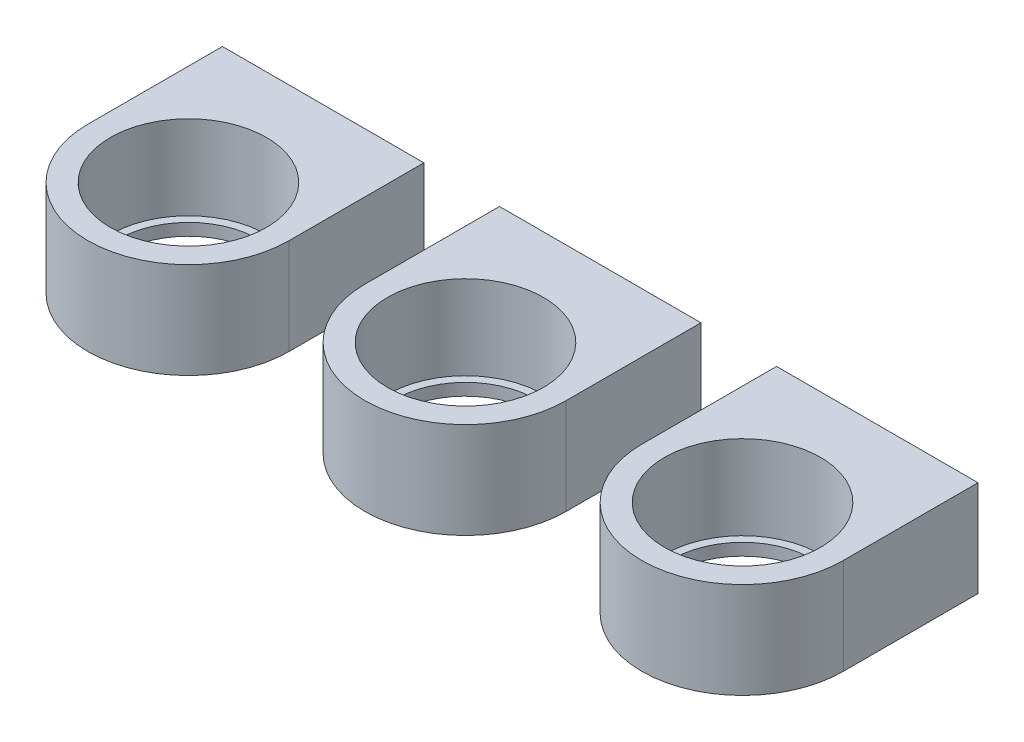
ISO-10303-21;
HEADER;
FILE_DESCRIPTION(('STEP AP214'),'2;1');
FILE_NAME('part.step','',(''),(''),'','','');
FILE_SCHEMA(('AUTOMOTIVE_DESIGN { 1 0 10303 214 1 1 1 1 }'));
ENDSEC;
DATA;
#1=APPLICATION_CONTEXT('core data for automotive mechanical design processes');
#2=APPLICATION_PROTOCOL_DEFINITION('international standard','automotive_design',2000,#1);
#3=PRODUCT_CONTEXT('',#1,'mechanical');
#4=PRODUCT('Part','Part','',(#3));
#5=PRODUCT_RELATED_PRODUCT_CATEGORY('part','',(#4));
#6=PRODUCT_DEFINITION_FORMATION('','',#4);
#7=PRODUCT_DEFINITION_CONTEXT('part definition',#1,'design');
#8=PRODUCT_DEFINITION('design','',#6,#7);
#9=PRODUCT_DEFINITION_SHAPE('','',#8);
#10=(LENGTH_UNIT() NAMED_UNIT(*) SI_UNIT(.MILLI.,.METRE.));
#11=(NAMED_UNIT(*) PLANE_ANGLE_UNIT() SI_UNIT($,.RADIAN.));
#12=(NAMED_UNIT(*) SI_UNIT($,.STERADIAN.) SOLID_ANGLE_UNIT());
#13=UNCERTAINTY_MEASURE_WITH_UNIT(LENGTH_MEASURE(1.E-05),#10,'distance_accuracy_value','');
#14=(GEOMETRIC_REPRESENTATION_CONTEXT(3) GLOBAL_UNCERTAINTY_ASSIGNED_CONTEXT((#13)) GLOBAL_UNIT_ASSIGNED_CONTEXT((#10,
#11,#12)) REPRESENTATION_CONTEXT('',''));
#15=CARTESIAN_POINT('',(0.,0.,0.));
#16=DIRECTION('',(0.,0.,1.));
#17=DIRECTION('',(1.,0.,0.));
#18=AXIS2_PLACEMENT_3D('',#15,#16,#17);
#19=CARTESIAN_POINT('',(-13.31875,12.7,-17.81875));
#20=DIRECTION('',(0.,0.,1.));
#21=DIRECTION('',(1.,0.,0.));
#22=AXIS2_PLACEMENT_3D('',#19,#20,#21);
#23=PLANE('',#22);
#24=DIRECTION('',(0.,-1.,0.));
#25=VECTOR('',#24,1.);
#26=CARTESIAN_POINT('',(13.31875,12.7,-17.81875));
#27=LINE('',#26,#25);
#28=CARTESIAN_POINT('',(13.31875,12.7,-17.81875));
#29=VERTEX_POINT('',#28);
#30=CARTESIAN_POINT('',(13.31875,0.,-17.81875));
#31=VERTEX_POINT('',#30);
#32=EDGE_CURVE('E99',#29,#31,#27,.T.);
#33=ORIENTED_EDGE('',*,*,#32,.T.);
#34=DIRECTION('',(1.,0.,0.));
#35=VECTOR('',#34,1.);
#36=CARTESIAN_POINT('',(-54.95625,0.,-17.81875));
#37=LINE('',#36,#35);
#38=CARTESIAN_POINT('',(-13.31875,0.,-17.81875));
#39=VERTEX_POINT('',#38);
#40=EDGE_CURVE('E12',#39,#31,#37,.T.);
#41=ORIENTED_EDGE('',*,*,#40,.F.);
#42=DIRECTION('',(0.,-1.,0.));
#43=VECTOR('',#42,1.);
#44=CARTESIAN_POINT('',(-13.31875,12.7,-17.81875));
#45=LINE('',#44,#43);
#46=CARTESIAN_POINT('',(-13.31875,12.7,-17.81875));
#47=VERTEX_POINT('',#46);
#48=EDGE_CURVE('E106',#47,#39,#45,.T.);
#49=ORIENTED_EDGE('',*,*,#48,.F.);
#50=DIRECTION('',(-1.,0.,0.));
#51=VECTOR('',#50,1.);
#52=CARTESIAN_POINT('',(-13.31875,12.7,-17.81875));
#53=LINE('',#52,#51);
#54=EDGE_CURVE('E89',#29,#47,#53,.T.);
#55=ORIENTED_EDGE('',*,*,#54,.F.);
#56=EDGE_LOOP('',(#33,#41,#49,#55));
#57=FACE_BOUND('',#56,.T.);
#58=ADVANCED_FACE('F47',(#57),#23,.F.);
#59=CARTESIAN_POINT('',(0.,12.7,0.));
#60=DIRECTION('',(0.,-1.,0.));
#61=DIRECTION('',(0.,0.,-1.));
#62=AXIS2_PLACEMENT_3D('',#59,#60,#61);
#63=CYLINDRICAL_SURFACE('',#62,9.25);
#64=CARTESIAN_POINT('',(0.,0.,0.));
#65=DIRECTION('',(0.,1.,0.));
#66=DIRECTION('',(0.,0.,1.));
#67=AXIS2_PLACEMENT_3D('',#64,#65,#66);
#68=CIRCLE('',#67,9.25);
#69=CARTESIAN_POINT('',(0.,0.,9.25));
#70=VERTEX_POINT('',#69);
#71=EDGE_CURVE('E55',#70,#70,#68,.T.);
#72=ORIENTED_EDGE('',*,*,#71,.F.);
#73=EDGE_LOOP('',(#72));
#74=FACE_BOUND('',#73,.T.);
#75=CARTESIAN_POINT('',(0.,1.5875,0.));
#76=DIRECTION('',(0.,1.,0.));
#77=DIRECTION('',(0.,0.,1.));
#78=AXIS2_PLACEMENT_3D('',#75,#76,#77);
#79=CIRCLE('',#78,9.25);
#80=CARTESIAN_POINT('',(0.,1.5875,9.25));
#81=VERTEX_POINT('',#80);
#82=EDGE_CURVE('E103',#81,#81,#79,.T.);
#83=ORIENTED_EDGE('',*,*,#82,.T.);
#84=EDGE_LOOP('',(#83));
#85=FACE_BOUND('',#84,.T.);
#86=ADVANCED_FACE('F133',(#74,#85),#63,.F.);
#87=CARTESIAN_POINT('',(0.,12.7,0.));
#88=DIRECTION('',(0.,1.,0.));
#89=DIRECTION('',(0.,0.,1.));
#90=AXIS2_PLACEMENT_3D('',#87,#88,#89);
#91=PLANE('',#90);
#92=CARTESIAN_POINT('',(0.,12.7,0.));
#93=DIRECTION('',(0.,1.,0.));
#94=DIRECTION('',(0.,0.,1.));
#95=AXIS2_PLACEMENT_3D('',#92,#93,#94);
#96=CIRCLE('',#95,10.31875);
#97=CARTESIAN_POINT('',(0.,12.7,10.31875));
#98=VERTEX_POINT('',#97);
#99=EDGE_CURVE('E117',#98,#98,#96,.T.);
#100=ORIENTED_EDGE('',*,*,#99,.F.);
#101=EDGE_LOOP('',(#100));
#102=FACE_BOUND('',#101,.T.);
#103=ORIENTED_EDGE('',*,*,#54,.T.);
#104=DIRECTION('',(0.,0.,1.));
#105=VECTOR('',#104,1.);
#106=CARTESIAN_POINT('',(-13.31875,12.7,-13.31875));
#107=LINE('',#106,#105);
#108=CARTESIAN_POINT('',(-13.31875,12.7,0.));
#109=VERTEX_POINT('',#108);
#110=EDGE_CURVE('E107',#47,#109,#107,.T.);
#111=ORIENTED_EDGE('',*,*,#110,.T.);
#112=CARTESIAN_POINT('',(0.,12.7,0.));
#113=DIRECTION('',(0.,1.,0.));
#114=DIRECTION('',(0.,0.,1.));
#115=AXIS2_PLACEMENT_3D('',#112,#113,#114);
#116=CIRCLE('',#115,13.31875);
#117=CARTESIAN_POINT('',(13.31875,12.7,0.));
#118=VERTEX_POINT('',#117);
#119=EDGE_CURVE('E92',#109,#118,#116,.T.);
#120=ORIENTED_EDGE('',*,*,#119,.T.);
#121=DIRECTION('',(0.,0.,-1.));
#122=VECTOR('',#121,1.);
#123=CARTESIAN_POINT('',(13.31875,12.7,-13.31875));
#124=LINE('',#123,#122);
#125=EDGE_CURVE('E85',#118,#29,#124,.T.);
#126=ORIENTED_EDGE('',*,*,#125,.T.);
#127=EDGE_LOOP('',(#103,#111,#120,#126));
#128=FACE_BOUND('',#127,.T.);
#129=ADVANCED_FACE('F87',(#102,#128),#91,.T.);
#130=CARTESIAN_POINT('',(-13.31875,12.7,0.));
#131=DIRECTION('',(1.,0.,0.));
#132=DIRECTION('',(0.,0.,-1.));
#133=AXIS2_PLACEMENT_3D('',#130,#131,#132);
#134=PLANE('',#133);
#135=DIRECTION('',(0.,0.,1.));
#136=VECTOR('',#135,1.);
#137=CARTESIAN_POINT('',(-13.31875,0.,0.));
#138=LINE('',#137,#136);
#139=CARTESIAN_POINT('',(-13.31875,0.,0.));
#140=VERTEX_POINT('',#139);
#141=EDGE_CURVE('E61',#39,#140,#138,.T.);
#142=ORIENTED_EDGE('',*,*,#141,.T.);
#143=DIRECTION('',(0.,-1.,0.));
#144=VECTOR('',#143,1.);
#145=CARTESIAN_POINT('',(-13.31875,12.7,0.));
#146=LINE('',#145,#144);
#147=EDGE_CURVE('E163',#109,#140,#146,.T.);
#148=ORIENTED_EDGE('',*,*,#147,.F.);
#149=ORIENTED_EDGE('',*,*,#110,.F.);
#150=ORIENTED_EDGE('',*,*,#48,.T.);
#151=EDGE_LOOP('',(#142,#148,#149,#150));
#152=FACE_BOUND('',#151,.T.);
#153=ADVANCED_FACE('F132',(#152),#134,.F.);
#154=CARTESIAN_POINT('',(0.,12.7,0.));
#155=DIRECTION('',(0.,-1.,0.));
#156=DIRECTION('',(0.,0.,-1.));
#157=AXIS2_PLACEMENT_3D('',#154,#155,#156);
#158=CYLINDRICAL_SURFACE('',#157,13.31875);
#159=CARTESIAN_POINT('',(0.,0.,0.));
#160=DIRECTION('',(0.,1.,0.));
#161=DIRECTION('',(0.,0.,1.));
#162=AXIS2_PLACEMENT_3D('',#159,#160,#161);
#163=CIRCLE('',#162,13.31875);
#164=CARTESIAN_POINT('',(13.31875,0.,0.));
#165=VERTEX_POINT('',#164);
#166=EDGE_CURVE('E67',#140,#165,#163,.T.);
#167=ORIENTED_EDGE('',*,*,#166,.T.);
#168=DIRECTION('',(0.,-1.,0.));
#169=VECTOR('',#168,1.);
#170=CARTESIAN_POINT('',(13.31875,12.7,0.));
#171=LINE('',#170,#169);
#172=EDGE_CURVE('E119',#118,#165,#171,.T.);
#173=ORIENTED_EDGE('',*,*,#172,.F.);
#174=ORIENTED_EDGE('',*,*,#119,.F.);
#175=ORIENTED_EDGE('',*,*,#147,.T.);
#176=EDGE_LOOP('',(#167,#173,#174,#175));
#177=FACE_BOUND('',#176,.T.);
#178=ADVANCED_FACE('F139',(#177),#158,.T.);
#179=CARTESIAN_POINT('',(13.31875,12.7,-17.81875));
#180=DIRECTION('',(-1.,0.,0.));
#181=DIRECTION('',(0.,0.,1.));
#182=AXIS2_PLACEMENT_3D('',#179,#180,#181);
#183=PLANE('',#182);
#184=DIRECTION('',(0.,0.,-1.));
#185=VECTOR('',#184,1.);
#186=CARTESIAN_POINT('',(13.31875,0.,-17.81875));
#187=LINE('',#186,#185);
#188=EDGE_CURVE('E101',#165,#31,#187,.T.);
#189=ORIENTED_EDGE('',*,*,#188,.T.);
#190=ORIENTED_EDGE('',*,*,#32,.F.);
#191=ORIENTED_EDGE('',*,*,#125,.F.);
#192=ORIENTED_EDGE('',*,*,#172,.T.);
#193=EDGE_LOOP('',(#189,#190,#191,#192));
#194=FACE_BOUND('',#193,.T.);
#195=ADVANCED_FACE('F100',(#194),#183,.F.);
#196=CARTESIAN_POINT('',(0.,1.5875,0.));
#197=DIRECTION('',(0.,1.,0.));
#198=DIRECTION('',(0.,0.,1.));
#199=AXIS2_PLACEMENT_3D('',#196,#197,#198);
#200=CYLINDRICAL_SURFACE('',#199,10.31875);
#201=CARTESIAN_POINT('',(0.,1.5875,0.));
#202=DIRECTION('',(0.,1.,0.));
#203=DIRECTION('',(0.,0.,1.));
#204=AXIS2_PLACEMENT_3D('',#201,#202,#203);
#205=CIRCLE('',#204,10.31875);
#206=CARTESIAN_POINT('',(0.,1.5875,10.31875));
#207=VERTEX_POINT('',#206);
#208=EDGE_CURVE('E116',#207,#207,#205,.T.);
#209=ORIENTED_EDGE('',*,*,#208,.F.);
#210=EDGE_LOOP('',(#209));
#211=FACE_BOUND('',#210,.T.);
#212=ORIENTED_EDGE('',*,*,#99,.T.);
#213=EDGE_LOOP('',(#212));
#214=FACE_BOUND('',#213,.T.);
#215=ADVANCED_FACE('F125',(#211,#214),#200,.F.);
#216=CARTESIAN_POINT('',(0.,1.5875,0.));
#217=DIRECTION('',(0.,1.,0.));
#218=DIRECTION('',(0.,0.,1.));
#219=AXIS2_PLACEMENT_3D('',#216,#217,#218);
#220=PLANE('',#219);
#221=ORIENTED_EDGE('',*,*,#82,.F.);
#222=EDGE_LOOP('',(#221));
#223=FACE_BOUND('',#222,.T.);
#224=ORIENTED_EDGE('',*,*,#208,.T.);
#225=EDGE_LOOP('',(#224));
#226=FACE_BOUND('',#225,.T.);
#227=ADVANCED_FACE('F123',(#223,#226),#220,.T.);
#228=CARTESIAN_POINT('',(-54.95625,0.,27.18125));
#229=DIRECTION('',(0.,1.,0.));
#230=DIRECTION('',(0.,0.,1.));
#231=AXIS2_PLACEMENT_3D('',#228,#229,#230);
#232=PLANE('',#231);
#233=ORIENTED_EDGE('',*,*,#71,.T.);
#234=EDGE_LOOP('',(#233));
#235=FACE_BOUND('',#234,.T.);
#236=ORIENTED_EDGE('',*,*,#40,.T.);
#237=ORIENTED_EDGE('',*,*,#188,.F.);
#238=ORIENTED_EDGE('',*,*,#166,.F.);
#239=ORIENTED_EDGE('',*,*,#141,.F.);
#240=EDGE_LOOP('',(#236,#237,#238,#239));
#241=FACE_BOUND('',#240,.T.);
#242=ADVANCED_FACE('F49',(#235,#241),#232,.F.);
#243=CLOSED_SHELL('',(#58,#86,#129,#153,#178,#195,#215,#227,#242));
#244=MANIFOLD_SOLID_BREP('B2',#243);
#245=CARTESIAN_POINT('',(36.6375,1.5875,0.));
#246=DIRECTION('',(0.,1.,0.));
#247=DIRECTION('',(0.,0.,1.));
#248=AXIS2_PLACEMENT_3D('',#245,#246,#247);
#249=PLANE('',#248);
#250=CARTESIAN_POINT('',(36.6375,1.5875,0.));
#251=DIRECTION('',(0.,-1.,0.));
#252=DIRECTION('',(0.,0.,1.));
#253=AXIS2_PLACEMENT_3D('',#250,#251,#252);
#254=CIRCLE('',#253,9.25);
#255=CARTESIAN_POINT('',(36.6375,1.5875,9.25));
#256=VERTEX_POINT('',#255);
#257=EDGE_CURVE('E333',#256,#256,#254,.T.);
#258=ORIENTED_EDGE('',*,*,#257,.T.);
#259=EDGE_LOOP('',(#258));
#260=FACE_BOUND('',#259,.T.);
#261=CARTESIAN_POINT('',(36.6375,1.5875,0.));
#262=DIRECTION('',(0.,-1.,0.));
#263=DIRECTION('',(0.,0.,1.));
#264=AXIS2_PLACEMENT_3D('',#261,#262,#263);
#265=CIRCLE('',#264,10.31875);
#266=CARTESIAN_POINT('',(36.6375,1.5875,10.31875));
#267=VERTEX_POINT('',#266);
#268=EDGE_CURVE('E332',#267,#267,#265,.T.);
#269=ORIENTED_EDGE('',*,*,#268,.F.);
#270=EDGE_LOOP('',(#269));
#271=FACE_BOUND('',#270,.T.);
#272=ADVANCED_FACE('F257',(#260,#271),#249,.T.);
#273=CARTESIAN_POINT('',(36.6375,12.7,0.));
#274=DIRECTION('',(0.,-1.,0.));
#275=DIRECTION('',(0.,0.,-1.));
#276=AXIS2_PLACEMENT_3D('',#273,#274,#275);
#277=CYLINDRICAL_SURFACE('',#276,9.25);
#278=CARTESIAN_POINT('',(36.6375,0.,0.));
#279=DIRECTION('',(0.,-1.,0.));
#280=DIRECTION('',(0.,0.,1.));
#281=AXIS2_PLACEMENT_3D('',#278,#279,#280);
#282=CIRCLE('',#281,9.25);
#283=CARTESIAN_POINT('',(36.6375,0.,9.25));
#284=VERTEX_POINT('',#283);
#285=EDGE_CURVE('E329',#284,#284,#282,.T.);
#286=ORIENTED_EDGE('',*,*,#285,.T.);
#287=EDGE_LOOP('',(#286));
#288=FACE_BOUND('',#287,.T.);
#289=ORIENTED_EDGE('',*,*,#257,.F.);
#290=EDGE_LOOP('',(#289));
#291=FACE_BOUND('',#290,.T.);
#292=ADVANCED_FACE('F346',(#288,#291),#277,.F.);
#293=CARTESIAN_POINT('',(36.6375,1.5875,0.));
#294=DIRECTION('',(0.,1.,0.));
#295=DIRECTION('',(0.,0.,1.));
#296=AXIS2_PLACEMENT_3D('',#293,#294,#295);
#297=CYLINDRICAL_SURFACE('',#296,10.31875);
#298=ORIENTED_EDGE('',*,*,#268,.T.);
#299=EDGE_LOOP('',(#298));
#300=FACE_BOUND('',#299,.T.);
#301=CARTESIAN_POINT('',(36.6375,12.7,0.));
#302=DIRECTION('',(0.,-1.,0.));
#303=DIRECTION('',(0.,0.,1.));
#304=AXIS2_PLACEMENT_3D('',#301,#302,#303);
#305=CIRCLE('',#304,10.31875);
#306=CARTESIAN_POINT('',(36.6375,12.7,10.31875));
#307=VERTEX_POINT('',#306);
#308=EDGE_CURVE('E334',#307,#307,#305,.T.);
#309=ORIENTED_EDGE('',*,*,#308,.F.);
#310=EDGE_LOOP('',(#309));
#311=FACE_BOUND('',#310,.T.);
#312=ADVANCED_FACE('F349',(#300,#311),#297,.F.);
#313=CARTESIAN_POINT('',(36.6375,12.7,0.));
#314=DIRECTION('',(0.,1.,0.));
#315=DIRECTION('',(0.,0.,1.));
#316=AXIS2_PLACEMENT_3D('',#313,#314,#315);
#317=PLANE('',#316);
#318=ORIENTED_EDGE('',*,*,#308,.T.);
#319=EDGE_LOOP('',(#318));
#320=FACE_BOUND('',#319,.T.);
#321=DIRECTION('',(1.,0.,0.));
#322=VECTOR('',#321,1.);
#323=CARTESIAN_POINT('',(49.95625,12.7,-17.81875));
#324=LINE('',#323,#322);
#325=CARTESIAN_POINT('',(23.31875,12.7,-17.81875));
#326=VERTEX_POINT('',#325);
#327=CARTESIAN_POINT('',(49.95625,12.7,-17.81875));
#328=VERTEX_POINT('',#327);
#329=EDGE_CURVE('E327',#326,#328,#324,.T.);
#330=ORIENTED_EDGE('',*,*,#329,.F.);
#331=DIRECTION('',(0.,0.,-1.));
#332=VECTOR('',#331,1.);
#333=CARTESIAN_POINT('',(23.31875,12.7,-13.31875));
#334=LINE('',#333,#332);
#335=CARTESIAN_POINT('',(23.31875,12.7,0.));
#336=VERTEX_POINT('',#335);
#337=EDGE_CURVE('E321',#336,#326,#334,.T.);
#338=ORIENTED_EDGE('',*,*,#337,.F.);
#339=CARTESIAN_POINT('',(36.6375,12.7,0.));
#340=DIRECTION('',(0.,-1.,0.));
#341=DIRECTION('',(0.,0.,1.));
#342=AXIS2_PLACEMENT_3D('',#339,#340,#341);
#343=CIRCLE('',#342,13.31875);
#344=CARTESIAN_POINT('',(49.95625,12.7,0.));
#345=VERTEX_POINT('',#344);
#346=EDGE_CURVE('E305',#345,#336,#343,.T.);
#347=ORIENTED_EDGE('',*,*,#346,.F.);
#348=DIRECTION('',(0.,0.,1.));
#349=VECTOR('',#348,1.);
#350=CARTESIAN_POINT('',(49.95625,12.7,-13.31875));
#351=LINE('',#350,#349);
#352=EDGE_CURVE('E313',#328,#345,#351,.T.);
#353=ORIENTED_EDGE('',*,*,#352,.F.);
#354=EDGE_LOOP('',(#330,#338,#347,#353));
#355=FACE_BOUND('',#354,.T.);
#356=ADVANCED_FACE('F320',(#320,#355),#317,.T.);
#357=CARTESIAN_POINT('',(23.31875,12.7,-17.81875));
#358=DIRECTION('',(1.,0.,0.));
#359=DIRECTION('',(0.,0.,1.));
#360=AXIS2_PLACEMENT_3D('',#357,#358,#359);
#361=PLANE('',#360);
#362=DIRECTION('',(0.,0.,-1.));
#363=VECTOR('',#362,1.);
#364=CARTESIAN_POINT('',(23.31875,0.,-17.81875));
#365=LINE('',#364,#363);
#366=CARTESIAN_POINT('',(23.31875,0.,0.));
#367=VERTEX_POINT('',#366);
#368=CARTESIAN_POINT('',(23.31875,0.,-17.81875));
#369=VERTEX_POINT('',#368);
#370=EDGE_CURVE('E282',#367,#369,#365,.T.);
#371=ORIENTED_EDGE('',*,*,#370,.F.);
#372=DIRECTION('',(0.,-1.,0.));
#373=VECTOR('',#372,1.);
#374=CARTESIAN_POINT('',(23.31875,12.7,0.));
#375=LINE('',#374,#373);
#376=EDGE_CURVE('E310',#336,#367,#375,.T.);
#377=ORIENTED_EDGE('',*,*,#376,.F.);
#378=ORIENTED_EDGE('',*,*,#337,.T.);
#379=DIRECTION('',(0.,-1.,0.));
#380=VECTOR('',#379,1.);
#381=CARTESIAN_POINT('',(23.31875,12.7,-17.81875));
#382=LINE('',#381,#380);
#383=EDGE_CURVE('E289',#326,#369,#382,.T.);
#384=ORIENTED_EDGE('',*,*,#383,.T.);
#385=EDGE_LOOP('',(#371,#377,#378,#384));
#386=FACE_BOUND('',#385,.T.);
#387=ADVANCED_FACE('F365',(#386),#361,.F.);
#388=CARTESIAN_POINT('',(36.6375,12.7,0.));
#389=DIRECTION('',(0.,-1.,0.));
#390=DIRECTION('',(0.,0.,-1.));
#391=AXIS2_PLACEMENT_3D('',#388,#389,#390);
#392=CYLINDRICAL_SURFACE('',#391,13.31875);
#393=CARTESIAN_POINT('',(36.6375,0.,0.));
#394=DIRECTION('',(0.,-1.,0.));
#395=DIRECTION('',(0.,0.,1.));
#396=AXIS2_PLACEMENT_3D('',#393,#394,#395);
#397=CIRCLE('',#396,13.31875);
#398=CARTESIAN_POINT('',(49.95625,0.,0.));
#399=VERTEX_POINT('',#398);
#400=EDGE_CURVE('E45',#399,#367,#397,.T.);
#401=ORIENTED_EDGE('',*,*,#400,.F.);
#402=DIRECTION('',(0.,-1.,0.));
#403=VECTOR('',#402,1.);
#404=CARTESIAN_POINT('',(49.95625,12.7,0.));
#405=LINE('',#404,#403);
#406=EDGE_CURVE('E300',#345,#399,#405,.T.);
#407=ORIENTED_EDGE('',*,*,#406,.F.);
#408=ORIENTED_EDGE('',*,*,#346,.T.);
#409=ORIENTED_EDGE('',*,*,#376,.T.);
#410=EDGE_LOOP('',(#401,#407,#408,#409));
#411=FACE_BOUND('',#410,.T.);
#412=ADVANCED_FACE('F302',(#411),#392,.T.);
#413=CARTESIAN_POINT('',(49.95625,12.7,0.));
#414=DIRECTION('',(-1.,0.,0.));
#415=DIRECTION('',(0.,0.,-1.));
#416=AXIS2_PLACEMENT_3D('',#413,#414,#415);
#417=PLANE('',#416);
#418=ORIENTED_EDGE('',*,*,#406,.T.);
#419=DIRECTION('',(0.,0.,-1.));
#420=VECTOR('',#419,1.);
#421=CARTESIAN_POINT('',(49.95625,0.,27.18125));
#422=LINE('',#421,#420);
#423=CARTESIAN_POINT('',(49.95625,0.,-17.81875));
#424=VERTEX_POINT('',#423);
#425=EDGE_CURVE('E309',#399,#424,#422,.T.);
#426=ORIENTED_EDGE('',*,*,#425,.T.);
#427=DIRECTION('',(0.,-1.,0.));
#428=VECTOR('',#427,1.);
#429=CARTESIAN_POINT('',(49.95625,12.7,-17.81875));
#430=LINE('',#429,#428);
#431=EDGE_CURVE('E316',#328,#424,#430,.T.);
#432=ORIENTED_EDGE('',*,*,#431,.F.);
#433=ORIENTED_EDGE('',*,*,#352,.T.);
#434=EDGE_LOOP('',(#418,#426,#432,#433));
#435=FACE_BOUND('',#434,.T.);
#436=ADVANCED_FACE('F314',(#435),#417,.F.);
#437=CARTESIAN_POINT('',(-13.31875,12.7,-17.81875));
#438=DIRECTION('',(0.,0.,1.));
#439=DIRECTION('',(1.,0.,0.));
#440=AXIS2_PLACEMENT_3D('',#437,#438,#439);
#441=PLANE('',#440);
#442=ORIENTED_EDGE('',*,*,#431,.T.);
#443=DIRECTION('',(1.,0.,0.));
#444=VECTOR('',#443,1.);
#445=CARTESIAN_POINT('',(-54.95625,0.,-17.81875));
#446=LINE('',#445,#444);
#447=EDGE_CURVE('E261',#369,#424,#446,.T.);
#448=ORIENTED_EDGE('',*,*,#447,.F.);
#449=ORIENTED_EDGE('',*,*,#383,.F.);
#450=ORIENTED_EDGE('',*,*,#329,.T.);
#451=EDGE_LOOP('',(#442,#448,#449,#450));
#452=FACE_BOUND('',#451,.T.);
#453=ADVANCED_FACE('F338',(#452),#441,.F.);
#454=CARTESIAN_POINT('',(-54.95625,0.,27.18125));
#455=DIRECTION('',(0.,1.,0.));
#456=DIRECTION('',(0.,0.,1.));
#457=AXIS2_PLACEMENT_3D('',#454,#455,#456);
#458=PLANE('',#457);
#459=ORIENTED_EDGE('',*,*,#370,.T.);
#460=ORIENTED_EDGE('',*,*,#447,.T.);
#461=ORIENTED_EDGE('',*,*,#425,.F.);
#462=ORIENTED_EDGE('',*,*,#400,.T.);
#463=EDGE_LOOP('',(#459,#460,#461,#462));
#464=FACE_BOUND('',#463,.T.);
#465=ORIENTED_EDGE('',*,*,#285,.F.);
#466=EDGE_LOOP('',(#465));
#467=FACE_BOUND('',#466,.T.);
#468=ADVANCED_FACE('F259',(#464,#467),#458,.F.);
#469=CLOSED_SHELL('',(#272,#292,#312,#356,#387,#412,#436,#453,#468));
#470=MANIFOLD_SOLID_BREP('B6',#469);
#471=CARTESIAN_POINT('',(-36.6375,1.5875,0.));
#472=DIRECTION('',(0.,1.,0.));
#473=DIRECTION('',(0.,0.,1.));
#474=AXIS2_PLACEMENT_3D('',#471,#472,#473);
#475=PLANE('',#474);
#476=CARTESIAN_POINT('',(-36.6375,1.5875,0.));
#477=DIRECTION('',(0.,-1.,0.));
#478=DIRECTION('',(0.,0.,1.));
#479=AXIS2_PLACEMENT_3D('',#476,#477,#478);
#480=CIRCLE('',#479,9.25);
#481=CARTESIAN_POINT('',(-36.6375,1.5875,9.25));
#482=VERTEX_POINT('',#481);
#483=EDGE_CURVE('E465',#482,#482,#480,.T.);
#484=ORIENTED_EDGE('',*,*,#483,.T.);
#485=EDGE_LOOP('',(#484));
#486=FACE_BOUND('',#485,.T.);
#487=CARTESIAN_POINT('',(-36.6375,1.5875,0.));
#488=DIRECTION('',(0.,-1.,0.));
#489=DIRECTION('',(0.,0.,1.));
#490=AXIS2_PLACEMENT_3D('',#487,#488,#489);
#491=CIRCLE('',#490,10.31875);
#492=CARTESIAN_POINT('',(-36.6375,1.5875,10.31875));
#493=VERTEX_POINT('',#492);
#494=EDGE_CURVE('E545',#493,#493,#491,.T.);
#495=ORIENTED_EDGE('',*,*,#494,.F.);
#496=EDGE_LOOP('',(#495));
#497=FACE_BOUND('',#496,.T.);
#498=ADVANCED_FACE('F461',(#486,#497),#475,.T.);
#499=CARTESIAN_POINT('',(-36.6375,12.7,0.));
#500=DIRECTION('',(0.,-1.,0.));
#501=DIRECTION('',(0.,0.,-1.));
#502=AXIS2_PLACEMENT_3D('',#499,#500,#501);
#503=CYLINDRICAL_SURFACE('',#502,9.25);
#504=CARTESIAN_POINT('',(-36.6375,0.,0.));
#505=DIRECTION('',(0.,-1.,0.));
#506=DIRECTION('',(0.,0.,1.));
#507=AXIS2_PLACEMENT_3D('',#504,#505,#506);
#508=CIRCLE('',#507,9.25);
#509=CARTESIAN_POINT('',(-36.6375,0.,9.25));
#510=VERTEX_POINT('',#509);
#511=EDGE_CURVE('E513',#510,#510,#508,.T.);
#512=ORIENTED_EDGE('',*,*,#511,.T.);
#513=EDGE_LOOP('',(#512));
#514=FACE_BOUND('',#513,.T.);
#515=ORIENTED_EDGE('',*,*,#483,.F.);
#516=EDGE_LOOP('',(#515));
#517=FACE_BOUND('',#516,.T.);
#518=ADVANCED_FACE('F554',(#514,#517),#503,.F.);
#519=CARTESIAN_POINT('',(-36.6375,1.5875,0.));
#520=DIRECTION('',(0.,1.,0.));
#521=DIRECTION('',(0.,0.,1.));
#522=AXIS2_PLACEMENT_3D('',#519,#520,#521);
#523=CYLINDRICAL_SURFACE('',#522,10.31875);
#524=ORIENTED_EDGE('',*,*,#494,.T.);
#525=EDGE_LOOP('',(#524));
#526=FACE_BOUND('',#525,.T.);
#527=CARTESIAN_POINT('',(-36.6375,12.7,0.));
#528=DIRECTION('',(0.,-1.,0.));
#529=DIRECTION('',(0.,0.,1.));
#530=AXIS2_PLACEMENT_3D('',#527,#528,#529);
#531=CIRCLE('',#530,10.31875);
#532=CARTESIAN_POINT('',(-36.6375,12.7,10.31875));
#533=VERTEX_POINT('',#532);
#534=EDGE_CURVE('E542',#533,#533,#531,.T.);
#535=ORIENTED_EDGE('',*,*,#534,.F.);
#536=EDGE_LOOP('',(#535));
#537=FACE_BOUND('',#536,.T.);
#538=ADVANCED_FACE('F556',(#526,#537),#523,.F.);
#539=CARTESIAN_POINT('',(-36.6375,12.7,0.));
#540=DIRECTION('',(0.,1.,0.));
#541=DIRECTION('',(0.,0.,1.));
#542=AXIS2_PLACEMENT_3D('',#539,#540,#541);
#543=PLANE('',#542);
#544=ORIENTED_EDGE('',*,*,#534,.T.);
#545=EDGE_LOOP('',(#544));
#546=FACE_BOUND('',#545,.T.);
#547=DIRECTION('',(1.,0.,0.));
#548=VECTOR('',#547,1.);
#549=CARTESIAN_POINT('',(-23.31875,12.7,-17.81875));
#550=LINE('',#549,#548);
#551=CARTESIAN_POINT('',(-49.95625,12.7,-17.81875));
#552=VERTEX_POINT('',#551);
#553=CARTESIAN_POINT('',(-23.31875,12.7,-17.81875));
#554=VERTEX_POINT('',#553);
#555=EDGE_CURVE('E511',#552,#554,#550,.T.);
#556=ORIENTED_EDGE('',*,*,#555,.F.);
#557=DIRECTION('',(0.,0.,-1.));
#558=VECTOR('',#557,1.);
#559=CARTESIAN_POINT('',(-49.95625,12.7,-13.31875));
#560=LINE('',#559,#558);
#561=CARTESIAN_POINT('',(-49.95625,12.7,0.));
#562=VERTEX_POINT('',#561);
#563=EDGE_CURVE('E517',#562,#552,#560,.T.);
#564=ORIENTED_EDGE('',*,*,#563,.F.);
#565=CARTESIAN_POINT('',(-36.6375,12.7,0.));
#566=DIRECTION('',(0.,-1.,0.));
#567=DIRECTION('',(0.,0.,1.));
#568=AXIS2_PLACEMENT_3D('',#565,#566,#567);
#569=CIRCLE('',#568,13.31875);
#570=CARTESIAN_POINT('',(-23.31875,12.7,0.));
#571=VERTEX_POINT('',#570);
#572=EDGE_CURVE('E521',#571,#562,#569,.T.);
#573=ORIENTED_EDGE('',*,*,#572,.F.);
#574=DIRECTION('',(0.,0.,1.));
#575=VECTOR('',#574,1.);
#576=CARTESIAN_POINT('',(-23.31875,12.7,-13.31875));
#577=LINE('',#576,#575);
#578=EDGE_CURVE('E531',#554,#571,#577,.T.);
#579=ORIENTED_EDGE('',*,*,#578,.F.);
#580=EDGE_LOOP('',(#556,#564,#573,#579));
#581=FACE_BOUND('',#580,.T.);
#582=ADVANCED_FACE('F563',(#546,#581),#543,.T.);
#583=CARTESIAN_POINT('',(-49.95625,12.7,-17.81875));
#584=DIRECTION('',(1.,0.,0.));
#585=DIRECTION('',(0.,0.,1.));
#586=AXIS2_PLACEMENT_3D('',#583,#584,#585);
#587=PLANE('',#586);
#588=DIRECTION('',(0.,0.,-1.));
#589=VECTOR('',#588,1.);
#590=CARTESIAN_POINT('',(-49.95625,0.,-17.81875));
#591=LINE('',#590,#589);
#592=CARTESIAN_POINT('',(-49.95625,0.,0.));
#593=VERTEX_POINT('',#592);
#594=CARTESIAN_POINT('',(-49.95625,0.,-17.81875));
#595=VERTEX_POINT('',#594);
#596=EDGE_CURVE('E504',#593,#595,#591,.T.);
#597=ORIENTED_EDGE('',*,*,#596,.F.);
#598=DIRECTION('',(0.,-1.,0.));
#599=VECTOR('',#598,1.);
#600=CARTESIAN_POINT('',(-49.95625,12.7,0.));
#601=LINE('',#600,#599);
#602=EDGE_CURVE('E484',#562,#593,#601,.T.);
#603=ORIENTED_EDGE('',*,*,#602,.F.);
#604=ORIENTED_EDGE('',*,*,#563,.T.);
#605=DIRECTION('',(0.,-1.,0.));
#606=VECTOR('',#605,1.);
#607=CARTESIAN_POINT('',(-49.95625,12.7,-17.81875));
#608=LINE('',#607,#606);
#609=EDGE_CURVE('E477',#552,#595,#608,.T.);
#610=ORIENTED_EDGE('',*,*,#609,.T.);
#611=EDGE_LOOP('',(#597,#603,#604,#610));
#612=FACE_BOUND('',#611,.T.);
#613=ADVANCED_FACE('F515',(#612),#587,.F.);
#614=CARTESIAN_POINT('',(-36.6375,12.7,0.));
#615=DIRECTION('',(0.,-1.,0.));
#616=DIRECTION('',(0.,0.,-1.));
#617=AXIS2_PLACEMENT_3D('',#614,#615,#616);
#618=CYLINDRICAL_SURFACE('',#617,13.31875);
#619=CARTESIAN_POINT('',(-36.6375,0.,0.));
#620=DIRECTION('',(0.,-1.,0.));
#621=DIRECTION('',(0.,0.,1.));
#622=AXIS2_PLACEMENT_3D('',#619,#620,#621);
#623=CIRCLE('',#622,13.31875);
#624=CARTESIAN_POINT('',(-23.31875,0.,0.));
#625=VERTEX_POINT('',#624);
#626=EDGE_CURVE('E510',#625,#593,#623,.T.);
#627=ORIENTED_EDGE('',*,*,#626,.F.);
#628=DIRECTION('',(0.,-1.,0.));
#629=VECTOR('',#628,1.);
#630=CARTESIAN_POINT('',(-23.31875,12.7,0.));
#631=LINE('',#630,#629);
#632=EDGE_CURVE('E470',#571,#625,#631,.T.);
#633=ORIENTED_EDGE('',*,*,#632,.F.);
#634=ORIENTED_EDGE('',*,*,#572,.T.);
#635=ORIENTED_EDGE('',*,*,#602,.T.);
#636=EDGE_LOOP('',(#627,#633,#634,#635));
#637=FACE_BOUND('',#636,.T.);
#638=ADVANCED_FACE('F534',(#637),#618,.T.);
#639=CARTESIAN_POINT('',(-23.31875,12.7,0.));
#640=DIRECTION('',(-1.,0.,0.));
#641=DIRECTION('',(0.,0.,-1.));
#642=AXIS2_PLACEMENT_3D('',#639,#640,#641);
#643=PLANE('',#642);
#644=DIRECTION('',(0.,0.,1.));
#645=VECTOR('',#644,1.);
#646=CARTESIAN_POINT('',(-23.31875,0.,0.));
#647=LINE('',#646,#645);
#648=CARTESIAN_POINT('',(-23.31875,0.,-17.81875));
#649=VERTEX_POINT('',#648);
#650=EDGE_CURVE('E529',#649,#625,#647,.T.);
#651=ORIENTED_EDGE('',*,*,#650,.F.);
#652=DIRECTION('',(0.,-1.,0.));
#653=VECTOR('',#652,1.);
#654=CARTESIAN_POINT('',(-23.31875,12.7,-17.81875));
#655=LINE('',#654,#653);
#656=EDGE_CURVE('E255',#554,#649,#655,.T.);
#657=ORIENTED_EDGE('',*,*,#656,.F.);
#658=ORIENTED_EDGE('',*,*,#578,.T.);
#659=ORIENTED_EDGE('',*,*,#632,.T.);
#660=EDGE_LOOP('',(#651,#657,#658,#659));
#661=FACE_BOUND('',#660,.T.);
#662=ADVANCED_FACE('F528',(#661),#643,.F.);
#663=CARTESIAN_POINT('',(-13.31875,12.7,-17.81875));
#664=DIRECTION('',(0.,0.,1.));
#665=DIRECTION('',(1.,0.,0.));
#666=AXIS2_PLACEMENT_3D('',#663,#664,#665);
#667=PLANE('',#666);
#668=ORIENTED_EDGE('',*,*,#656,.T.);
#669=DIRECTION('',(1.,0.,0.));
#670=VECTOR('',#669,1.);
#671=CARTESIAN_POINT('',(-54.95625,0.,-17.81875));
#672=LINE('',#671,#670);
#673=EDGE_CURVE('E507',#595,#649,#672,.T.);
#674=ORIENTED_EDGE('',*,*,#673,.F.);
#675=ORIENTED_EDGE('',*,*,#609,.F.);
#676=ORIENTED_EDGE('',*,*,#555,.T.);
#677=EDGE_LOOP('',(#668,#674,#675,#676));
#678=FACE_BOUND('',#677,.T.);
#679=ADVANCED_FACE('F463',(#678),#667,.F.);
#680=CARTESIAN_POINT('',(-54.95625,0.,27.18125));
#681=DIRECTION('',(0.,1.,0.));
#682=DIRECTION('',(0.,0.,1.));
#683=AXIS2_PLACEMENT_3D('',#680,#681,#682);
#684=PLANE('',#683);
#685=ORIENTED_EDGE('',*,*,#626,.T.);
#686=ORIENTED_EDGE('',*,*,#596,.T.);
#687=ORIENTED_EDGE('',*,*,#673,.T.);
#688=ORIENTED_EDGE('',*,*,#650,.T.);
#689=EDGE_LOOP('',(#685,#686,#687,#688));
#690=FACE_BOUND('',#689,.T.);
#691=ORIENTED_EDGE('',*,*,#511,.F.);
#692=EDGE_LOOP('',(#691));
#693=FACE_BOUND('',#692,.T.);
#694=ADVANCED_FACE('F505',(#690,#693),#684,.F.);
#695=CLOSED_SHELL('',(#498,#518,#538,#582,#613,#638,#662,#679,#694));
#696=MANIFOLD_SOLID_BREP('B39',#695);
#697=ADVANCED_BREP_SHAPE_REPRESENTATION('',(#18,#244,#470,#696),#14);
#698=SHAPE_DEFINITION_REPRESENTATION(#9,#697);
ENDSEC;
END-ISO-10303-21;
